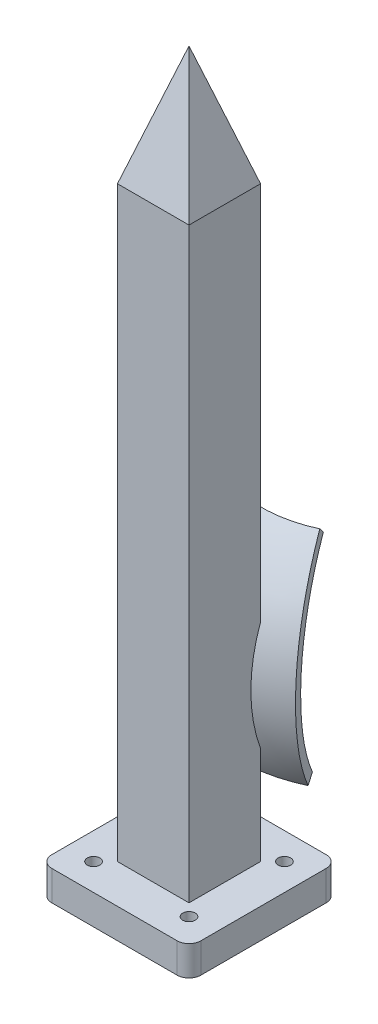
ISO-10303-21;
HEADER;
FILE_DESCRIPTION(('STEP AP214'),'2;1');
FILE_NAME('part.step','',(''),(''),'','','');
FILE_SCHEMA(('AUTOMOTIVE_DESIGN { 1 0 10303 214 1 1 1 1 }'));
ENDSEC;
DATA;
#1=APPLICATION_CONTEXT('core data for automotive mechanical design processes');
#2=APPLICATION_PROTOCOL_DEFINITION('international standard','automotive_design',2000,#1);
#3=PRODUCT_CONTEXT('',#1,'mechanical');
#4=PRODUCT('Part','Part','',(#3));
#5=PRODUCT_RELATED_PRODUCT_CATEGORY('part','',(#4));
#6=PRODUCT_DEFINITION_FORMATION('','',#4);
#7=PRODUCT_DEFINITION_CONTEXT('part definition',#1,'design');
#8=PRODUCT_DEFINITION('design','',#6,#7);
#9=PRODUCT_DEFINITION_SHAPE('','',#8);
#10=(LENGTH_UNIT() NAMED_UNIT(*) SI_UNIT(.MILLI.,.METRE.));
#11=(NAMED_UNIT(*) PLANE_ANGLE_UNIT() SI_UNIT($,.RADIAN.));
#12=(NAMED_UNIT(*) SI_UNIT($,.STERADIAN.) SOLID_ANGLE_UNIT());
#13=UNCERTAINTY_MEASURE_WITH_UNIT(LENGTH_MEASURE(1.E-05),#10,'distance_accuracy_value','');
#14=(GEOMETRIC_REPRESENTATION_CONTEXT(3) GLOBAL_UNCERTAINTY_ASSIGNED_CONTEXT((#13)) GLOBAL_UNIT_ASSIGNED_CONTEXT((#10,
#11,#12)) REPRESENTATION_CONTEXT('',''));
#15=CARTESIAN_POINT('',(0.,0.,0.));
#16=DIRECTION('',(0.,0.,1.));
#17=DIRECTION('',(1.,0.,0.));
#18=AXIS2_PLACEMENT_3D('',#15,#16,#17);
#19=CARTESIAN_POINT('',(18.5,103.425,-6.5));
#20=DIRECTION('',(-1.,0.,0.));
#21=DIRECTION('',(0.,0.,1.));
#22=AXIS2_PLACEMENT_3D('',#19,#20,#21);
#23=PLANE('',#22);
#24=CARTESIAN_POINT('',(18.5,30.6059271862154,-43.6169817591008));
#25=DIRECTION('',(-1.,0.,0.));
#26=DIRECTION('',(0.,0.,1.));
#27=AXIS2_PLACEMENT_3D('',#24,#25,#26);
#28=CIRCLE('',#27,26.7452367752012);
#29=CARTESIAN_POINT('',(18.5,39.7953187588153,-18.5));
#30=VERTEX_POINT('',#29);
#31=CARTESIAN_POINT('',(18.5,21.4165356136154,-18.5));
#32=VERTEX_POINT('',#31);
#33=EDGE_CURVE('E58',#30,#32,#28,.F.);
#34=ORIENTED_EDGE('',*,*,#33,.F.);
#35=DIRECTION('',(0.,-1.,0.));
#36=VECTOR('',#35,1.);
#37=CARTESIAN_POINT('',(18.5,103.425,-18.5));
#38=LINE('',#37,#36);
#39=CARTESIAN_POINT('',(18.5,103.425,-18.5));
#40=VERTEX_POINT('',#39);
#41=EDGE_CURVE('E304',#40,#30,#38,.T.);
#42=ORIENTED_EDGE('',*,*,#41,.F.);
#43=DIRECTION('',(0.,0.,1.));
#44=VECTOR('',#43,1.);
#45=CARTESIAN_POINT('',(18.5,103.425,-26.5));
#46=LINE('',#45,#44);
#47=CARTESIAN_POINT('',(18.5,103.425,-6.5));
#48=VERTEX_POINT('',#47);
#49=EDGE_CURVE('E253',#40,#48,#46,.T.);
#50=ORIENTED_EDGE('',*,*,#49,.T.);
#51=DIRECTION('',(0.,-1.,0.));
#52=VECTOR('',#51,1.);
#53=CARTESIAN_POINT('',(18.5,103.425,-6.5));
#54=LINE('',#53,#52);
#55=CARTESIAN_POINT('',(18.5,5.,-6.5));
#56=VERTEX_POINT('',#55);
#57=EDGE_CURVE('E306',#48,#56,#54,.T.);
#58=ORIENTED_EDGE('',*,*,#57,.T.);
#59=DIRECTION('',(0.,0.,-1.));
#60=VECTOR('',#59,1.);
#61=CARTESIAN_POINT('',(18.5,5.,-6.5));
#62=LINE('',#61,#60);
#63=CARTESIAN_POINT('',(18.5,5.,-18.5));
#64=VERTEX_POINT('',#63);
#65=EDGE_CURVE('E294',#56,#64,#62,.T.);
#66=ORIENTED_EDGE('',*,*,#65,.T.);
#67=EDGE_CURVE('E303',#32,#64,#38,.T.);
#68=ORIENTED_EDGE('',*,*,#67,.F.);
#69=EDGE_LOOP('',(#34,#42,#50,#58,#66,#68));
#70=FACE_BOUND('',#69,.T.);
#71=ADVANCED_FACE('F35',(#70),#23,.F.);
#72=CARTESIAN_POINT('',(6.5,103.425,-18.5));
#73=DIRECTION('',(0.,0.,1.));
#74=DIRECTION('',(1.,0.,0.));
#75=AXIS2_PLACEMENT_3D('',#72,#73,#74);
#76=PLANE('',#75);
#77=CARTESIAN_POINT('',(12.5,30.6059271862154,-18.5));
#78=DIRECTION('',(0.,0.,1.));
#79=DIRECTION('',(1.,0.,0.));
#80=AXIS2_PLACEMENT_3D('',#77,#78,#79);
#81=CIRCLE('',#80,10.9747399729821);
#82=CARTESIAN_POINT('',(6.5,21.4165356136154,-18.5));
#83=VERTEX_POINT('',#82);
#84=EDGE_CURVE('E51',#32,#83,#81,.F.);
#85=ORIENTED_EDGE('',*,*,#84,.F.);
#86=ORIENTED_EDGE('',*,*,#67,.T.);
#87=DIRECTION('',(-1.,0.,0.));
#88=VECTOR('',#87,1.);
#89=CARTESIAN_POINT('',(6.5,5.,-18.5));
#90=LINE('',#89,#88);
#91=CARTESIAN_POINT('',(6.5,5.,-18.5));
#92=VERTEX_POINT('',#91);
#93=EDGE_CURVE('E297',#64,#92,#90,.T.);
#94=ORIENTED_EDGE('',*,*,#93,.T.);
#95=DIRECTION('',(0.,-1.,0.));
#96=VECTOR('',#95,1.);
#97=CARTESIAN_POINT('',(6.5,103.425,-18.5));
#98=LINE('',#97,#96);
#99=EDGE_CURVE('E300',#83,#92,#98,.T.);
#100=ORIENTED_EDGE('',*,*,#99,.F.);
#101=EDGE_LOOP('',(#85,#86,#94,#100));
#102=FACE_BOUND('',#101,.T.);
#103=ADVANCED_FACE('F414',(#102),#76,.F.);
#104=CARTESIAN_POINT('',(6.5,39.7953187588153,-18.5));
#105=VERTEX_POINT('',#104);
#106=EDGE_CURVE('E201',#105,#30,#81,.F.);
#107=ORIENTED_EDGE('',*,*,#106,.F.);
#108=CARTESIAN_POINT('',(6.5,103.425,-18.5));
#109=VERTEX_POINT('',#108);
#110=EDGE_CURVE('E301',#109,#105,#98,.T.);
#111=ORIENTED_EDGE('',*,*,#110,.F.);
#112=DIRECTION('',(-1.,0.,0.));
#113=VECTOR('',#112,1.);
#114=CARTESIAN_POINT('',(26.5,103.425,-18.5));
#115=LINE('',#114,#113);
#116=EDGE_CURVE('E237',#40,#109,#115,.T.);
#117=ORIENTED_EDGE('',*,*,#116,.F.);
#118=ORIENTED_EDGE('',*,*,#41,.T.);
#119=EDGE_LOOP('',(#107,#111,#117,#118));
#120=FACE_BOUND('',#119,.T.);
#121=ADVANCED_FACE('F419',(#120),#76,.F.);
#122=CARTESIAN_POINT('',(6.5,103.425,-6.5));
#123=DIRECTION('',(1.,0.,0.));
#124=DIRECTION('',(0.,0.,-1.));
#125=AXIS2_PLACEMENT_3D('',#122,#123,#124);
#126=PLANE('',#125);
#127=CARTESIAN_POINT('',(6.5,30.6059271862154,-43.6169817591008));
#128=DIRECTION('',(1.,0.,0.));
#129=DIRECTION('',(0.,0.,-1.));
#130=AXIS2_PLACEMENT_3D('',#127,#128,#129);
#131=CIRCLE('',#130,26.7452367752012);
#132=EDGE_CURVE('E11',#83,#105,#131,.F.);
#133=ORIENTED_EDGE('',*,*,#132,.F.);
#134=ORIENTED_EDGE('',*,*,#99,.T.);
#135=DIRECTION('',(0.,0.,1.));
#136=VECTOR('',#135,1.);
#137=CARTESIAN_POINT('',(6.5,5.,-6.5));
#138=LINE('',#137,#136);
#139=CARTESIAN_POINT('',(6.5,5.,-6.5));
#140=VERTEX_POINT('',#139);
#141=EDGE_CURVE('E288',#92,#140,#138,.T.);
#142=ORIENTED_EDGE('',*,*,#141,.T.);
#143=DIRECTION('',(0.,-1.,0.));
#144=VECTOR('',#143,1.);
#145=CARTESIAN_POINT('',(6.5,103.425,-6.5));
#146=LINE('',#145,#144);
#147=CARTESIAN_POINT('',(6.5,103.425,-6.5));
#148=VERTEX_POINT('',#147);
#149=EDGE_CURVE('E308',#148,#140,#146,.T.);
#150=ORIENTED_EDGE('',*,*,#149,.F.);
#151=DIRECTION('',(0.,0.,1.));
#152=VECTOR('',#151,1.);
#153=CARTESIAN_POINT('',(6.5,103.425,-26.5));
#154=LINE('',#153,#152);
#155=EDGE_CURVE('E250',#109,#148,#154,.T.);
#156=ORIENTED_EDGE('',*,*,#155,.F.);
#157=ORIENTED_EDGE('',*,*,#110,.T.);
#158=EDGE_LOOP('',(#133,#134,#142,#150,#156,#157));
#159=FACE_BOUND('',#158,.T.);
#160=ADVANCED_FACE('F408',(#159),#126,.F.);
#161=CARTESIAN_POINT('',(6.5,103.425,-6.5));
#162=DIRECTION('',(0.,0.,-1.));
#163=DIRECTION('',(-1.,0.,0.));
#164=AXIS2_PLACEMENT_3D('',#161,#162,#163);
#165=PLANE('',#164);
#166=DIRECTION('',(-1.,0.,0.));
#167=VECTOR('',#166,1.);
#168=CARTESIAN_POINT('',(26.5,103.425,-6.5));
#169=LINE('',#168,#167);
#170=EDGE_CURVE('E244',#48,#148,#169,.T.);
#171=ORIENTED_EDGE('',*,*,#170,.T.);
#172=ORIENTED_EDGE('',*,*,#149,.T.);
#173=DIRECTION('',(1.,0.,0.));
#174=VECTOR('',#173,1.);
#175=CARTESIAN_POINT('',(6.5,5.,-6.5));
#176=LINE('',#175,#174);
#177=EDGE_CURVE('E291',#140,#56,#176,.T.);
#178=ORIENTED_EDGE('',*,*,#177,.T.);
#179=ORIENTED_EDGE('',*,*,#57,.F.);
#180=EDGE_LOOP('',(#171,#172,#178,#179));
#181=FACE_BOUND('',#180,.T.);
#182=ADVANCED_FACE('F401',(#181),#165,.F.);
#183=CARTESIAN_POINT('',(45.4380733944954,13.6314220183486,-26.5));
#184=DIRECTION('',(0.957826285221151,0.287347885566345,0.));
#185=DIRECTION('',(-0.287347885566345,0.957826285221152,0.));
#186=AXIS2_PLACEMENT_3D('',#183,#184,#185);
#187=PLANE('',#186);
#188=DIRECTION('',(0.276172385369497,-0.920574617898324,-0.276172385369497));
#189=VECTOR('',#188,1.);
#190=CARTESIAN_POINT('',(43.9936440677966,18.4461864406779,-43.9936440677966));
#191=LINE('',#190,#189);
#192=CARTESIAN_POINT('',(12.5,123.425,-12.5));
#193=VERTEX_POINT('',#192);
#194=EDGE_CURVE('E242',#193,#40,#191,.T.);
#195=ORIENTED_EDGE('',*,*,#194,.F.);
#196=DIRECTION('',(0.276172385369497,-0.920574617898324,0.276172385369497));
#197=VECTOR('',#196,1.);
#198=CARTESIAN_POINT('',(41.8580508474576,25.5648305084745,16.8580508474576));
#199=LINE('',#198,#197);
#200=EDGE_CURVE('E247',#193,#48,#199,.T.);
#201=ORIENTED_EDGE('',*,*,#200,.T.);
#202=ORIENTED_EDGE('',*,*,#49,.F.);
#203=EDGE_LOOP('',(#195,#201,#202));
#204=FACE_BOUND('',#203,.T.);
#205=ADVANCED_FACE('F424',(#204),#187,.T.);
#206=CARTESIAN_POINT('',(-22.5022935779817,6.7506880733945,-26.5));
#207=DIRECTION('',(0.957826285221151,-0.287347885566346,0.));
#208=DIRECTION('',(0.287347885566346,0.957826285221151,0.));
#209=AXIS2_PLACEMENT_3D('',#206,#207,#208);
#210=PLANE('',#209);
#211=DIRECTION('',(-0.276172385369497,-0.920574617898324,0.276172385369497));
#212=VECTOR('',#211,1.);
#213=CARTESIAN_POINT('',(-18.7648305084746,19.2088983050847,18.7648305084746));
#214=LINE('',#213,#212);
#215=EDGE_CURVE('E44',#193,#148,#214,.T.);
#216=ORIENTED_EDGE('',*,*,#215,.F.);
#217=DIRECTION('',(-0.276172385369497,-0.920574617898323,-0.276172385369497));
#218=VECTOR('',#217,1.);
#219=CARTESIAN_POINT('',(-20.9004237288136,12.0902542372881,-45.9004237288135));
#220=LINE('',#219,#218);
#221=EDGE_CURVE('E239',#193,#109,#220,.T.);
#222=ORIENTED_EDGE('',*,*,#221,.T.);
#223=ORIENTED_EDGE('',*,*,#155,.T.);
#224=EDGE_LOOP('',(#216,#222,#223));
#225=FACE_BOUND('',#224,.T.);
#226=ADVANCED_FACE('F405',(#225),#210,.F.);
#227=CARTESIAN_POINT('',(0.,5.,0.));
#228=DIRECTION('',(0.,-1.,0.));
#229=DIRECTION('',(0.,0.,-1.));
#230=AXIS2_PLACEMENT_3D('',#227,#228,#229);
#231=PLANE('',#230);
#232=CARTESIAN_POINT('',(4.5,5.,-20.5));
#233=DIRECTION('',(0.,1.,0.));
#234=DIRECTION('',(0.,0.,1.));
#235=AXIS2_PLACEMENT_3D('',#232,#233,#234);
#236=CIRCLE('',#235,1.05);
#237=CARTESIAN_POINT('',(4.5,5.,-19.45));
#238=VERTEX_POINT('',#237);
#239=EDGE_CURVE('E310',#238,#238,#236,.T.);
#240=ORIENTED_EDGE('',*,*,#239,.F.);
#241=EDGE_LOOP('',(#240));
#242=FACE_BOUND('',#241,.T.);
#243=CARTESIAN_POINT('',(20.5,5.,-20.5));
#244=DIRECTION('',(0.,1.,0.));
#245=DIRECTION('',(0.,0.,1.));
#246=AXIS2_PLACEMENT_3D('',#243,#244,#245);
#247=CIRCLE('',#246,1.05);
#248=CARTESIAN_POINT('',(20.5,5.,-19.45));
#249=VERTEX_POINT('',#248);
#250=EDGE_CURVE('E314',#249,#249,#247,.T.);
#251=ORIENTED_EDGE('',*,*,#250,.F.);
#252=EDGE_LOOP('',(#251));
#253=FACE_BOUND('',#252,.T.);
#254=CARTESIAN_POINT('',(20.5,5.,-4.5));
#255=DIRECTION('',(0.,1.,0.));
#256=DIRECTION('',(0.,0.,1.));
#257=AXIS2_PLACEMENT_3D('',#254,#255,#256);
#258=CIRCLE('',#257,1.05);
#259=CARTESIAN_POINT('',(20.5,5.,-3.45));
#260=VERTEX_POINT('',#259);
#261=EDGE_CURVE('E320',#260,#260,#258,.T.);
#262=ORIENTED_EDGE('',*,*,#261,.F.);
#263=EDGE_LOOP('',(#262));
#264=FACE_BOUND('',#263,.T.);
#265=CARTESIAN_POINT('',(4.5,5.,-4.5));
#266=DIRECTION('',(0.,1.,0.));
#267=DIRECTION('',(0.,0.,1.));
#268=AXIS2_PLACEMENT_3D('',#265,#266,#267);
#269=CIRCLE('',#268,1.05);
#270=CARTESIAN_POINT('',(4.5,5.,-3.45));
#271=VERTEX_POINT('',#270);
#272=EDGE_CURVE('E326',#271,#271,#269,.T.);
#273=ORIENTED_EDGE('',*,*,#272,.F.);
#274=EDGE_LOOP('',(#273));
#275=FACE_BOUND('',#274,.T.);
#276=DIRECTION('',(-1.,0.,0.));
#277=VECTOR('',#276,1.);
#278=CARTESIAN_POINT('',(0.,5.,-25.));
#279=LINE('',#278,#277);
#280=CARTESIAN_POINT('',(23.,5.,-25.));
#281=VERTEX_POINT('',#280);
#282=CARTESIAN_POINT('',(2.,5.,-25.));
#283=VERTEX_POINT('',#282);
#284=EDGE_CURVE('E345',#281,#283,#279,.T.);
#285=ORIENTED_EDGE('',*,*,#284,.T.);
#286=CARTESIAN_POINT('',(2.,5.,-23.));
#287=DIRECTION('',(0.,-1.,0.));
#288=DIRECTION('',(0.,0.,-1.));
#289=AXIS2_PLACEMENT_3D('',#286,#287,#288);
#290=CIRCLE('',#289,2.);
#291=CARTESIAN_POINT('',(0.,5.,-23.));
#292=VERTEX_POINT('',#291);
#293=EDGE_CURVE('E382',#283,#292,#290,.F.);
#294=ORIENTED_EDGE('',*,*,#293,.T.);
#295=DIRECTION('',(0.,0.,1.));
#296=VECTOR('',#295,1.);
#297=CARTESIAN_POINT('',(0.,5.,0.));
#298=LINE('',#297,#296);
#299=CARTESIAN_POINT('',(0.,5.,-2.));
#300=VERTEX_POINT('',#299);
#301=EDGE_CURVE('E335',#292,#300,#298,.T.);
#302=ORIENTED_EDGE('',*,*,#301,.T.);
#303=CARTESIAN_POINT('',(2.,5.,-2.));
#304=DIRECTION('',(0.,-1.,0.));
#305=DIRECTION('',(0.,0.,-1.));
#306=AXIS2_PLACEMENT_3D('',#303,#304,#305);
#307=CIRCLE('',#306,2.);
#308=CARTESIAN_POINT('',(2.,5.,0.));
#309=VERTEX_POINT('',#308);
#310=EDGE_CURVE('E380',#300,#309,#307,.F.);
#311=ORIENTED_EDGE('',*,*,#310,.T.);
#312=DIRECTION('',(1.,0.,0.));
#313=VECTOR('',#312,1.);
#314=CARTESIAN_POINT('',(0.,5.,0.));
#315=LINE('',#314,#313);
#316=CARTESIAN_POINT('',(23.,5.,0.));
#317=VERTEX_POINT('',#316);
#318=EDGE_CURVE('E338',#309,#317,#315,.T.);
#319=ORIENTED_EDGE('',*,*,#318,.T.);
#320=CARTESIAN_POINT('',(23.,5.,-2.));
#321=DIRECTION('',(0.,-1.,0.));
#322=DIRECTION('',(0.,0.,-1.));
#323=AXIS2_PLACEMENT_3D('',#320,#321,#322);
#324=CIRCLE('',#323,2.);
#325=CARTESIAN_POINT('',(25.,5.,-2.));
#326=VERTEX_POINT('',#325);
#327=EDGE_CURVE('E376',#317,#326,#324,.F.);
#328=ORIENTED_EDGE('',*,*,#327,.T.);
#329=DIRECTION('',(0.,0.,-1.));
#330=VECTOR('',#329,1.);
#331=CARTESIAN_POINT('',(25.,5.,0.));
#332=LINE('',#331,#330);
#333=CARTESIAN_POINT('',(25.,5.,-23.));
#334=VERTEX_POINT('',#333);
#335=EDGE_CURVE('E342',#326,#334,#332,.T.);
#336=ORIENTED_EDGE('',*,*,#335,.T.);
#337=CARTESIAN_POINT('',(23.,5.,-23.));
#338=DIRECTION('',(0.,-1.,0.));
#339=DIRECTION('',(0.,0.,-1.));
#340=AXIS2_PLACEMENT_3D('',#337,#338,#339);
#341=CIRCLE('',#340,2.);
#342=EDGE_CURVE('E378',#334,#281,#341,.F.);
#343=ORIENTED_EDGE('',*,*,#342,.T.);
#344=EDGE_LOOP('',(#285,#294,#302,#311,#319,#328,#336,#343));
#345=FACE_BOUND('',#344,.T.);
#346=ORIENTED_EDGE('',*,*,#141,.F.);
#347=ORIENTED_EDGE('',*,*,#93,.F.);
#348=ORIENTED_EDGE('',*,*,#65,.F.);
#349=ORIENTED_EDGE('',*,*,#177,.F.);
#350=EDGE_LOOP('',(#346,#347,#348,#349));
#351=FACE_BOUND('',#350,.T.);
#352=ADVANCED_FACE('F412',(#242,#253,#264,#275,#345,#351),#231,.F.);
#353=CARTESIAN_POINT('',(0.,5.,0.));
#354=DIRECTION('',(1.,0.,0.));
#355=DIRECTION('',(0.,0.,-1.));
#356=AXIS2_PLACEMENT_3D('',#353,#354,#355);
#357=PLANE('',#356);
#358=ORIENTED_EDGE('',*,*,#301,.F.);
#359=DIRECTION('',(0.,-1.,0.));
#360=VECTOR('',#359,1.);
#361=CARTESIAN_POINT('',(0.,5.,-23.));
#362=LINE('',#361,#360);
#363=CARTESIAN_POINT('',(0.,0.,-23.));
#364=VERTEX_POINT('',#363);
#365=EDGE_CURVE('E360',#292,#364,#362,.T.);
#366=ORIENTED_EDGE('',*,*,#365,.T.);
#367=DIRECTION('',(0.,0.,1.));
#368=VECTOR('',#367,1.);
#369=CARTESIAN_POINT('',(0.,0.,0.));
#370=LINE('',#369,#368);
#371=CARTESIAN_POINT('',(0.,0.,-2.));
#372=VERTEX_POINT('',#371);
#373=EDGE_CURVE('E332',#364,#372,#370,.T.);
#374=ORIENTED_EDGE('',*,*,#373,.T.);
#375=DIRECTION('',(0.,-1.,0.));
#376=VECTOR('',#375,1.);
#377=CARTESIAN_POINT('',(0.,5.,-2.));
#378=LINE('',#377,#376);
#379=EDGE_CURVE('E348',#372,#300,#378,.F.);
#380=ORIENTED_EDGE('',*,*,#379,.T.);
#381=EDGE_LOOP('',(#358,#366,#374,#380));
#382=FACE_BOUND('',#381,.T.);
#383=ADVANCED_FACE('F469',(#382),#357,.F.);
#384=CARTESIAN_POINT('',(0.,5.,0.));
#385=DIRECTION('',(0.,0.,-1.));
#386=DIRECTION('',(-1.,0.,0.));
#387=AXIS2_PLACEMENT_3D('',#384,#385,#386);
#388=PLANE('',#387);
#389=ORIENTED_EDGE('',*,*,#318,.F.);
#390=DIRECTION('',(0.,-1.,0.));
#391=VECTOR('',#390,1.);
#392=CARTESIAN_POINT('',(2.,5.,0.));
#393=LINE('',#392,#391);
#394=CARTESIAN_POINT('',(2.,0.,0.));
#395=VERTEX_POINT('',#394);
#396=EDGE_CURVE('E386',#309,#395,#393,.T.);
#397=ORIENTED_EDGE('',*,*,#396,.T.);
#398=DIRECTION('',(1.,0.,0.));
#399=VECTOR('',#398,1.);
#400=CARTESIAN_POINT('',(0.,0.,0.));
#401=LINE('',#400,#399);
#402=CARTESIAN_POINT('',(23.,0.,0.));
#403=VERTEX_POINT('',#402);
#404=EDGE_CURVE('E351',#395,#403,#401,.T.);
#405=ORIENTED_EDGE('',*,*,#404,.T.);
#406=DIRECTION('',(0.,-1.,0.));
#407=VECTOR('',#406,1.);
#408=CARTESIAN_POINT('',(23.,5.,0.));
#409=LINE('',#408,#407);
#410=EDGE_CURVE('E384',#403,#317,#409,.F.);
#411=ORIENTED_EDGE('',*,*,#410,.T.);
#412=EDGE_LOOP('',(#389,#397,#405,#411));
#413=FACE_BOUND('',#412,.T.);
#414=ADVANCED_FACE('F481',(#413),#388,.F.);
#415=CARTESIAN_POINT('',(25.,5.,0.));
#416=DIRECTION('',(-1.,0.,0.));
#417=DIRECTION('',(0.,0.,1.));
#418=AXIS2_PLACEMENT_3D('',#415,#416,#417);
#419=PLANE('',#418);
#420=DIRECTION('',(0.,0.,-1.));
#421=VECTOR('',#420,1.);
#422=CARTESIAN_POINT('',(25.,0.,0.));
#423=LINE('',#422,#421);
#424=CARTESIAN_POINT('',(25.,0.,-2.));
#425=VERTEX_POINT('',#424);
#426=CARTESIAN_POINT('',(25.,0.,-23.));
#427=VERTEX_POINT('',#426);
#428=EDGE_CURVE('E354',#425,#427,#423,.T.);
#429=ORIENTED_EDGE('',*,*,#428,.T.);
#430=DIRECTION('',(0.,-1.,0.));
#431=VECTOR('',#430,1.);
#432=CARTESIAN_POINT('',(25.,5.,-23.));
#433=LINE('',#432,#431);
#434=EDGE_CURVE('E392',#427,#334,#433,.F.);
#435=ORIENTED_EDGE('',*,*,#434,.T.);
#436=ORIENTED_EDGE('',*,*,#335,.F.);
#437=DIRECTION('',(0.,-1.,0.));
#438=VECTOR('',#437,1.);
#439=CARTESIAN_POINT('',(25.,5.,-2.));
#440=LINE('',#439,#438);
#441=EDGE_CURVE('E389',#326,#425,#440,.T.);
#442=ORIENTED_EDGE('',*,*,#441,.T.);
#443=EDGE_LOOP('',(#429,#435,#436,#442));
#444=FACE_BOUND('',#443,.T.);
#445=ADVANCED_FACE('F477',(#444),#419,.F.);
#446=CARTESIAN_POINT('',(0.,5.,-25.));
#447=DIRECTION('',(0.,0.,1.));
#448=DIRECTION('',(1.,0.,0.));
#449=AXIS2_PLACEMENT_3D('',#446,#447,#448);
#450=PLANE('',#449);
#451=DIRECTION('',(-1.,0.,0.));
#452=VECTOR('',#451,1.);
#453=CARTESIAN_POINT('',(0.,0.,-25.));
#454=LINE('',#453,#452);
#455=CARTESIAN_POINT('',(23.,0.,-25.));
#456=VERTEX_POINT('',#455);
#457=CARTESIAN_POINT('',(2.,0.,-25.));
#458=VERTEX_POINT('',#457);
#459=EDGE_CURVE('E339',#456,#458,#454,.T.);
#460=ORIENTED_EDGE('',*,*,#459,.T.);
#461=DIRECTION('',(0.,-1.,0.));
#462=VECTOR('',#461,1.);
#463=CARTESIAN_POINT('',(2.,5.,-25.));
#464=LINE('',#463,#462);
#465=EDGE_CURVE('E374',#458,#283,#464,.F.);
#466=ORIENTED_EDGE('',*,*,#465,.T.);
#467=ORIENTED_EDGE('',*,*,#284,.F.);
#468=DIRECTION('',(0.,-1.,0.));
#469=VECTOR('',#468,1.);
#470=CARTESIAN_POINT('',(23.,5.,-25.));
#471=LINE('',#470,#469);
#472=EDGE_CURVE('E371',#281,#456,#471,.T.);
#473=ORIENTED_EDGE('',*,*,#472,.T.);
#474=EDGE_LOOP('',(#460,#466,#467,#473));
#475=FACE_BOUND('',#474,.T.);
#476=ADVANCED_FACE('F473',(#475),#450,.F.);
#477=CARTESIAN_POINT('',(0.,0.,0.));
#478=DIRECTION('',(0.,-1.,0.));
#479=DIRECTION('',(0.,0.,-1.));
#480=AXIS2_PLACEMENT_3D('',#477,#478,#479);
#481=PLANE('',#480);
#482=DIRECTION('',(0.,0.,1.));
#483=VECTOR('',#482,1.);
#484=CARTESIAN_POINT('',(15.5,0.,-9.50000000000001));
#485=LINE('',#484,#483);
#486=CARTESIAN_POINT('',(15.5,0.,-15.5));
#487=VERTEX_POINT('',#486);
#488=CARTESIAN_POINT('',(15.5,0.,-9.50000000000001));
#489=VERTEX_POINT('',#488);
#490=EDGE_CURVE('E256',#487,#489,#485,.T.);
#491=ORIENTED_EDGE('',*,*,#490,.F.);
#492=DIRECTION('',(1.,0.,0.));
#493=VECTOR('',#492,1.);
#494=CARTESIAN_POINT('',(9.5,0.,-15.5));
#495=LINE('',#494,#493);
#496=CARTESIAN_POINT('',(9.5,0.,-15.5));
#497=VERTEX_POINT('',#496);
#498=EDGE_CURVE('E265',#497,#487,#495,.T.);
#499=ORIENTED_EDGE('',*,*,#498,.F.);
#500=DIRECTION('',(0.,0.,-1.));
#501=VECTOR('',#500,1.);
#502=CARTESIAN_POINT('',(9.5,0.,-9.50000000000001));
#503=LINE('',#502,#501);
#504=CARTESIAN_POINT('',(9.5,0.,-9.50000000000001));
#505=VERTEX_POINT('',#504);
#506=EDGE_CURVE('E262',#505,#497,#503,.T.);
#507=ORIENTED_EDGE('',*,*,#506,.F.);
#508=DIRECTION('',(-1.,0.,0.));
#509=VECTOR('',#508,1.);
#510=CARTESIAN_POINT('',(9.5,0.,-9.50000000000001));
#511=LINE('',#510,#509);
#512=EDGE_CURVE('E259',#489,#505,#511,.T.);
#513=ORIENTED_EDGE('',*,*,#512,.F.);
#514=EDGE_LOOP('',(#491,#499,#507,#513));
#515=FACE_BOUND('',#514,.T.);
#516=CARTESIAN_POINT('',(4.5,0.,-20.5));
#517=DIRECTION('',(0.,1.,0.));
#518=DIRECTION('',(0.,0.,1.));
#519=AXIS2_PLACEMENT_3D('',#516,#517,#518);
#520=CIRCLE('',#519,1.05);
#521=CARTESIAN_POINT('',(4.5,0.,-19.45));
#522=VERTEX_POINT('',#521);
#523=EDGE_CURVE('E311',#522,#522,#520,.T.);
#524=ORIENTED_EDGE('',*,*,#523,.T.);
#525=EDGE_LOOP('',(#524));
#526=FACE_BOUND('',#525,.T.);
#527=CARTESIAN_POINT('',(20.5,0.,-20.5));
#528=DIRECTION('',(0.,1.,0.));
#529=DIRECTION('',(0.,0.,1.));
#530=AXIS2_PLACEMENT_3D('',#527,#528,#529);
#531=CIRCLE('',#530,1.05);
#532=CARTESIAN_POINT('',(20.5,0.,-19.45));
#533=VERTEX_POINT('',#532);
#534=EDGE_CURVE('E317',#533,#533,#531,.T.);
#535=ORIENTED_EDGE('',*,*,#534,.T.);
#536=EDGE_LOOP('',(#535));
#537=FACE_BOUND('',#536,.T.);
#538=CARTESIAN_POINT('',(20.5,0.,-4.5));
#539=DIRECTION('',(0.,1.,0.));
#540=DIRECTION('',(0.,0.,1.));
#541=AXIS2_PLACEMENT_3D('',#538,#539,#540);
#542=CIRCLE('',#541,1.05);
#543=CARTESIAN_POINT('',(20.5,0.,-3.45));
#544=VERTEX_POINT('',#543);
#545=EDGE_CURVE('E323',#544,#544,#542,.T.);
#546=ORIENTED_EDGE('',*,*,#545,.T.);
#547=EDGE_LOOP('',(#546));
#548=FACE_BOUND('',#547,.T.);
#549=CARTESIAN_POINT('',(4.5,0.,-4.5));
#550=DIRECTION('',(0.,1.,0.));
#551=DIRECTION('',(0.,0.,1.));
#552=AXIS2_PLACEMENT_3D('',#549,#550,#551);
#553=CIRCLE('',#552,1.05);
#554=CARTESIAN_POINT('',(4.5,0.,-3.45));
#555=VERTEX_POINT('',#554);
#556=EDGE_CURVE('E329',#555,#555,#553,.T.);
#557=ORIENTED_EDGE('',*,*,#556,.T.);
#558=EDGE_LOOP('',(#557));
#559=FACE_BOUND('',#558,.T.);
#560=ORIENTED_EDGE('',*,*,#373,.F.);
#561=CARTESIAN_POINT('',(2.,0.,-23.));
#562=DIRECTION('',(0.,-1.,0.));
#563=DIRECTION('',(0.,0.,-1.));
#564=AXIS2_PLACEMENT_3D('',#561,#562,#563);
#565=CIRCLE('',#564,2.);
#566=EDGE_CURVE('E369',#364,#458,#565,.T.);
#567=ORIENTED_EDGE('',*,*,#566,.T.);
#568=ORIENTED_EDGE('',*,*,#459,.F.);
#569=CARTESIAN_POINT('',(23.,0.,-23.));
#570=DIRECTION('',(0.,-1.,0.));
#571=DIRECTION('',(0.,0.,-1.));
#572=AXIS2_PLACEMENT_3D('',#569,#570,#571);
#573=CIRCLE('',#572,2.);
#574=EDGE_CURVE('E365',#456,#427,#573,.T.);
#575=ORIENTED_EDGE('',*,*,#574,.T.);
#576=ORIENTED_EDGE('',*,*,#428,.F.);
#577=CARTESIAN_POINT('',(23.,0.,-2.));
#578=DIRECTION('',(0.,-1.,0.));
#579=DIRECTION('',(0.,0.,-1.));
#580=AXIS2_PLACEMENT_3D('',#577,#578,#579);
#581=CIRCLE('',#580,2.);
#582=EDGE_CURVE('E363',#425,#403,#581,.T.);
#583=ORIENTED_EDGE('',*,*,#582,.T.);
#584=ORIENTED_EDGE('',*,*,#404,.F.);
#585=CARTESIAN_POINT('',(2.,0.,-2.));
#586=DIRECTION('',(0.,-1.,0.));
#587=DIRECTION('',(0.,0.,-1.));
#588=AXIS2_PLACEMENT_3D('',#585,#586,#587);
#589=CIRCLE('',#588,2.);
#590=EDGE_CURVE('E367',#395,#372,#589,.T.);
#591=ORIENTED_EDGE('',*,*,#590,.T.);
#592=EDGE_LOOP('',(#560,#567,#568,#575,#576,#583,#584,#591));
#593=FACE_BOUND('',#592,.T.);
#594=ADVANCED_FACE('F465',(#515,#526,#537,#548,#559,#593),#481,.T.);
#595=CARTESIAN_POINT('',(4.5,0.,-4.5));
#596=DIRECTION('',(0.,1.,0.));
#597=DIRECTION('',(0.,0.,1.));
#598=AXIS2_PLACEMENT_3D('',#595,#596,#597);
#599=CYLINDRICAL_SURFACE('',#598,1.05);
#600=ORIENTED_EDGE('',*,*,#556,.F.);
#601=EDGE_LOOP('',(#600));
#602=FACE_BOUND('',#601,.T.);
#603=ORIENTED_EDGE('',*,*,#272,.T.);
#604=EDGE_LOOP('',(#603));
#605=FACE_BOUND('',#604,.T.);
#606=ADVANCED_FACE('F461',(#602,#605),#599,.F.);
#607=CARTESIAN_POINT('',(20.5,0.,-4.5));
#608=DIRECTION('',(0.,1.,0.));
#609=DIRECTION('',(0.,0.,1.));
#610=AXIS2_PLACEMENT_3D('',#607,#608,#609);
#611=CYLINDRICAL_SURFACE('',#610,1.05);
#612=ORIENTED_EDGE('',*,*,#545,.F.);
#613=EDGE_LOOP('',(#612));
#614=FACE_BOUND('',#613,.T.);
#615=ORIENTED_EDGE('',*,*,#261,.T.);
#616=EDGE_LOOP('',(#615));
#617=FACE_BOUND('',#616,.T.);
#618=ADVANCED_FACE('F457',(#614,#617),#611,.F.);
#619=CARTESIAN_POINT('',(20.5,0.,-20.5));
#620=DIRECTION('',(0.,1.,0.));
#621=DIRECTION('',(0.,0.,1.));
#622=AXIS2_PLACEMENT_3D('',#619,#620,#621);
#623=CYLINDRICAL_SURFACE('',#622,1.05);
#624=ORIENTED_EDGE('',*,*,#534,.F.);
#625=EDGE_LOOP('',(#624));
#626=FACE_BOUND('',#625,.T.);
#627=ORIENTED_EDGE('',*,*,#250,.T.);
#628=EDGE_LOOP('',(#627));
#629=FACE_BOUND('',#628,.T.);
#630=ADVANCED_FACE('F453',(#626,#629),#623,.F.);
#631=CARTESIAN_POINT('',(4.5,0.,-20.5));
#632=DIRECTION('',(0.,1.,0.));
#633=DIRECTION('',(0.,0.,1.));
#634=AXIS2_PLACEMENT_3D('',#631,#632,#633);
#635=CYLINDRICAL_SURFACE('',#634,1.05);
#636=ORIENTED_EDGE('',*,*,#523,.F.);
#637=EDGE_LOOP('',(#636));
#638=FACE_BOUND('',#637,.T.);
#639=ORIENTED_EDGE('',*,*,#239,.T.);
#640=EDGE_LOOP('',(#639));
#641=FACE_BOUND('',#640,.T.);
#642=ADVANCED_FACE('F449',(#638,#641),#635,.F.);
#643=CARTESIAN_POINT('',(2.,5.,-23.));
#644=DIRECTION('',(0.,-1.,0.));
#645=DIRECTION('',(0.,0.,-1.));
#646=AXIS2_PLACEMENT_3D('',#643,#644,#645);
#647=CYLINDRICAL_SURFACE('',#646,2.);
#648=ORIENTED_EDGE('',*,*,#293,.F.);
#649=ORIENTED_EDGE('',*,*,#465,.F.);
#650=ORIENTED_EDGE('',*,*,#566,.F.);
#651=ORIENTED_EDGE('',*,*,#365,.F.);
#652=EDGE_LOOP('',(#648,#649,#650,#651));
#653=FACE_BOUND('',#652,.T.);
#654=ADVANCED_FACE('F452',(#653),#647,.T.);
#655=CARTESIAN_POINT('',(2.,5.,-2.));
#656=DIRECTION('',(0.,-1.,0.));
#657=DIRECTION('',(0.,0.,-1.));
#658=AXIS2_PLACEMENT_3D('',#655,#656,#657);
#659=CYLINDRICAL_SURFACE('',#658,2.);
#660=ORIENTED_EDGE('',*,*,#310,.F.);
#661=ORIENTED_EDGE('',*,*,#379,.F.);
#662=ORIENTED_EDGE('',*,*,#590,.F.);
#663=ORIENTED_EDGE('',*,*,#396,.F.);
#664=EDGE_LOOP('',(#660,#661,#662,#663));
#665=FACE_BOUND('',#664,.T.);
#666=ADVANCED_FACE('F491',(#665),#659,.T.);
#667=CARTESIAN_POINT('',(23.,5.,-23.));
#668=DIRECTION('',(0.,-1.,0.));
#669=DIRECTION('',(0.,0.,-1.));
#670=AXIS2_PLACEMENT_3D('',#667,#668,#669);
#671=CYLINDRICAL_SURFACE('',#670,2.);
#672=ORIENTED_EDGE('',*,*,#342,.F.);
#673=ORIENTED_EDGE('',*,*,#434,.F.);
#674=ORIENTED_EDGE('',*,*,#574,.F.);
#675=ORIENTED_EDGE('',*,*,#472,.F.);
#676=EDGE_LOOP('',(#672,#673,#674,#675));
#677=FACE_BOUND('',#676,.T.);
#678=ADVANCED_FACE('F494',(#677),#671,.T.);
#679=CARTESIAN_POINT('',(23.,5.,-2.));
#680=DIRECTION('',(0.,-1.,0.));
#681=DIRECTION('',(0.,0.,-1.));
#682=AXIS2_PLACEMENT_3D('',#679,#680,#681);
#683=CYLINDRICAL_SURFACE('',#682,2.);
#684=ORIENTED_EDGE('',*,*,#327,.F.);
#685=ORIENTED_EDGE('',*,*,#410,.F.);
#686=ORIENTED_EDGE('',*,*,#582,.F.);
#687=ORIENTED_EDGE('',*,*,#441,.F.);
#688=EDGE_LOOP('',(#684,#685,#686,#687));
#689=FACE_BOUND('',#688,.T.);
#690=ADVANCED_FACE('F37',(#689),#683,.T.);
#691=CARTESIAN_POINT('',(15.5,103.425,-15.5));
#692=DIRECTION('',(-1.,0.,0.));
#693=DIRECTION('',(0.,0.,1.));
#694=AXIS2_PLACEMENT_3D('',#691,#692,#693);
#695=PLANE('',#694);
#696=ORIENTED_EDGE('',*,*,#490,.T.);
#697=DIRECTION('',(0.,-1.,0.));
#698=VECTOR('',#697,1.);
#699=CARTESIAN_POINT('',(15.5,103.425,-9.5));
#700=LINE('',#699,#698);
#701=CARTESIAN_POINT('',(15.5,103.425,-9.5));
#702=VERTEX_POINT('',#701);
#703=EDGE_CURVE('E280',#702,#489,#700,.T.);
#704=ORIENTED_EDGE('',*,*,#703,.F.);
#705=DIRECTION('',(0.,0.,-1.));
#706=VECTOR('',#705,1.);
#707=CARTESIAN_POINT('',(15.5,103.425,-15.5));
#708=LINE('',#707,#706);
#709=CARTESIAN_POINT('',(15.5,103.425,-15.5));
#710=VERTEX_POINT('',#709);
#711=EDGE_CURVE('E268',#702,#710,#708,.T.);
#712=ORIENTED_EDGE('',*,*,#711,.T.);
#713=DIRECTION('',(0.,-1.,0.));
#714=VECTOR('',#713,1.);
#715=CARTESIAN_POINT('',(15.5,103.425,-15.5));
#716=LINE('',#715,#714);
#717=EDGE_CURVE('E286',#710,#487,#716,.T.);
#718=ORIENTED_EDGE('',*,*,#717,.T.);
#719=EDGE_LOOP('',(#696,#704,#712,#718));
#720=FACE_BOUND('',#719,.T.);
#721=ADVANCED_FACE('F501',(#720),#695,.T.);
#722=CARTESIAN_POINT('',(9.5,103.425,-15.5));
#723=DIRECTION('',(0.,0.,1.));
#724=DIRECTION('',(1.,0.,0.));
#725=AXIS2_PLACEMENT_3D('',#722,#723,#724);
#726=PLANE('',#725);
#727=ORIENTED_EDGE('',*,*,#498,.T.);
#728=ORIENTED_EDGE('',*,*,#717,.F.);
#729=DIRECTION('',(-1.,0.,0.));
#730=VECTOR('',#729,1.);
#731=CARTESIAN_POINT('',(9.5,103.425,-15.5));
#732=LINE('',#731,#730);
#733=CARTESIAN_POINT('',(9.5,103.425,-15.5));
#734=VERTEX_POINT('',#733);
#735=EDGE_CURVE('E271',#710,#734,#732,.T.);
#736=ORIENTED_EDGE('',*,*,#735,.T.);
#737=DIRECTION('',(0.,-1.,0.));
#738=VECTOR('',#737,1.);
#739=CARTESIAN_POINT('',(9.5,103.425,-15.5));
#740=LINE('',#739,#738);
#741=EDGE_CURVE('E284',#734,#497,#740,.T.);
#742=ORIENTED_EDGE('',*,*,#741,.T.);
#743=EDGE_LOOP('',(#727,#728,#736,#742));
#744=FACE_BOUND('',#743,.T.);
#745=ADVANCED_FACE('F528',(#744),#726,.T.);
#746=CARTESIAN_POINT('',(9.5,103.425,-15.5));
#747=DIRECTION('',(1.,0.,0.));
#748=DIRECTION('',(0.,0.,-1.));
#749=AXIS2_PLACEMENT_3D('',#746,#747,#748);
#750=PLANE('',#749);
#751=ORIENTED_EDGE('',*,*,#506,.T.);
#752=ORIENTED_EDGE('',*,*,#741,.F.);
#753=DIRECTION('',(0.,0.,1.));
#754=VECTOR('',#753,1.);
#755=CARTESIAN_POINT('',(9.5,103.425,-15.5));
#756=LINE('',#755,#754);
#757=CARTESIAN_POINT('',(9.5,103.425,-9.5));
#758=VERTEX_POINT('',#757);
#759=EDGE_CURVE('E274',#734,#758,#756,.T.);
#760=ORIENTED_EDGE('',*,*,#759,.T.);
#761=DIRECTION('',(0.,-1.,0.));
#762=VECTOR('',#761,1.);
#763=CARTESIAN_POINT('',(9.5,103.425,-9.5));
#764=LINE('',#763,#762);
#765=EDGE_CURVE('E282',#758,#505,#764,.T.);
#766=ORIENTED_EDGE('',*,*,#765,.T.);
#767=EDGE_LOOP('',(#751,#752,#760,#766));
#768=FACE_BOUND('',#767,.T.);
#769=ADVANCED_FACE('F533',(#768),#750,.T.);
#770=CARTESIAN_POINT('',(9.5,103.425,-9.5));
#771=DIRECTION('',(0.,0.,-1.));
#772=DIRECTION('',(-1.,0.,0.));
#773=AXIS2_PLACEMENT_3D('',#770,#771,#772);
#774=PLANE('',#773);
#775=ORIENTED_EDGE('',*,*,#512,.T.);
#776=ORIENTED_EDGE('',*,*,#765,.F.);
#777=DIRECTION('',(1.,0.,0.));
#778=VECTOR('',#777,1.);
#779=CARTESIAN_POINT('',(9.5,103.425,-9.5));
#780=LINE('',#779,#778);
#781=EDGE_CURVE('E277',#758,#702,#780,.T.);
#782=ORIENTED_EDGE('',*,*,#781,.T.);
#783=ORIENTED_EDGE('',*,*,#703,.T.);
#784=EDGE_LOOP('',(#775,#776,#782,#783));
#785=FACE_BOUND('',#784,.T.);
#786=ADVANCED_FACE('F539',(#785),#774,.T.);
#787=CARTESIAN_POINT('',(0.,103.425,0.));
#788=DIRECTION('',(0.,-1.,0.));
#789=DIRECTION('',(0.,0.,-1.));
#790=AXIS2_PLACEMENT_3D('',#787,#788,#789);
#791=PLANE('',#790);
#792=ORIENTED_EDGE('',*,*,#735,.F.);
#793=ORIENTED_EDGE('',*,*,#711,.F.);
#794=ORIENTED_EDGE('',*,*,#781,.F.);
#795=ORIENTED_EDGE('',*,*,#759,.F.);
#796=EDGE_LOOP('',(#792,#793,#794,#795));
#797=FACE_BOUND('',#796,.T.);
#798=ADVANCED_FACE('F434',(#797),#791,.T.);
#799=CARTESIAN_POINT('',(26.5,6.75068807339448,22.5022935779816));
#800=DIRECTION('',(0.,0.287347885566345,0.957826285221151));
#801=DIRECTION('',(0.,-0.957826285221152,0.287347885566345));
#802=AXIS2_PLACEMENT_3D('',#799,#800,#801);
#803=PLANE('',#802);
#804=ORIENTED_EDGE('',*,*,#215,.T.);
#805=ORIENTED_EDGE('',*,*,#170,.F.);
#806=ORIENTED_EDGE('',*,*,#200,.F.);
#807=EDGE_LOOP('',(#804,#805,#806));
#808=FACE_BOUND('',#807,.T.);
#809=ADVANCED_FACE('F397',(#808),#803,.T.);
#810=CARTESIAN_POINT('',(26.5,13.6314220183486,-45.4380733944954));
#811=DIRECTION('',(0.,-0.287347885566345,0.957826285221152));
#812=DIRECTION('',(0.,-0.957826285221152,-0.287347885566345));
#813=AXIS2_PLACEMENT_3D('',#810,#811,#812);
#814=PLANE('',#813);
#815=ORIENTED_EDGE('',*,*,#194,.T.);
#816=ORIENTED_EDGE('',*,*,#116,.T.);
#817=ORIENTED_EDGE('',*,*,#221,.F.);
#818=EDGE_LOOP('',(#815,#816,#817));
#819=FACE_BOUND('',#818,.T.);
#820=ADVANCED_FACE('F426',(#819),#814,.F.);
#821=CARTESIAN_POINT('',(12.5,30.6059271862154,-43.6169817591008));
#822=DIRECTION('',(0.,1.,0.));
#823=DIRECTION('',(-0.4226182617407,0.,0.90630778703665));
#824=AXIS2_PLACEMENT_3D('',#821,#822,#823);
#825=SPHERICAL_SURFACE('',#824,25.6199469617793);
#826=CARTESIAN_POINT('',(12.5,49.0814718555662,-43.6169817591008));
#827=DIRECTION('',(0.,1.,0.));
#828=DIRECTION('',(0.,0.,1.));
#829=AXIS2_PLACEMENT_3D('',#826,#827,#828);
#830=CIRCLE('',#829,17.7492515756357);
#831=CARTESIAN_POINT('',(4.99884215190647,49.0814718555662,-27.5306968420297));
#832=VERTEX_POINT('',#831);
#833=CARTESIAN_POINT('',(20.0011578480935,49.0814718555662,-27.5306968420297));
#834=VERTEX_POINT('',#833);
#835=EDGE_CURVE('E202',#832,#834,#830,.T.);
#836=ORIENTED_EDGE('',*,*,#835,.T.);
#837=CARTESIAN_POINT('',(12.5,30.6059271862154,-43.6169817591008));
#838=DIRECTION('',(0.90630778703665,0.,-0.4226182617407));
#839=DIRECTION('',(-0.4226182617407,0.,-0.90630778703665));
#840=AXIS2_PLACEMENT_3D('',#837,#838,#839);
#841=CIRCLE('',#840,25.6199469617793);
#842=CARTESIAN_POINT('',(21.6083862279321,16.7538154660889,-24.0839844586265));
#843=VERTEX_POINT('',#842);
#844=EDGE_CURVE('E208',#843,#834,#841,.F.);
#845=ORIENTED_EDGE('',*,*,#844,.F.);
#846=CARTESIAN_POINT('',(12.5,16.7538154660889,-43.6169817591008));
#847=DIRECTION('',(0.,1.,0.));
#848=DIRECTION('',(0.,0.,1.));
#849=AXIS2_PLACEMENT_3D('',#846,#847,#848);
#850=CIRCLE('',#849,21.5522779124973);
#851=CARTESIAN_POINT('',(3.3916137720679,16.7538154660889,-24.0839844586265));
#852=VERTEX_POINT('',#851);
#853=EDGE_CURVE('E190',#852,#843,#850,.T.);
#854=ORIENTED_EDGE('',*,*,#853,.F.);
#855=CARTESIAN_POINT('',(12.5,30.6059271862154,-43.6169817591008));
#856=DIRECTION('',(0.90630778703665,0.,0.4226182617407));
#857=DIRECTION('',(0.4226182617407,0.,-0.90630778703665));
#858=AXIS2_PLACEMENT_3D('',#855,#856,#857);
#859=CIRCLE('',#858,25.6199469617793);
#860=EDGE_CURVE('E221',#852,#832,#859,.F.);
#861=ORIENTED_EDGE('',*,*,#860,.T.);
#862=EDGE_LOOP('',(#836,#845,#854,#861));
#863=FACE_BOUND('',#862,.T.);
#864=CARTESIAN_POINT('',(12.5,30.6059271862154,-18.5));
#865=DIRECTION('',(0.,0.,1.));
#866=DIRECTION('',(1.,0.,0.));
#867=AXIS2_PLACEMENT_3D('',#864,#865,#866);
#868=CIRCLE('',#867,5.05162445529979);
#869=CARTESIAN_POINT('',(17.5516244552998,30.6059271862154,-18.5));
#870=VERTEX_POINT('',#869);
#871=EDGE_CURVE('E39',#870,#870,#868,.F.);
#872=ORIENTED_EDGE('',*,*,#871,.F.);
#873=EDGE_LOOP('',(#872));
#874=FACE_BOUND('',#873,.T.);
#875=ADVANCED_FACE('F213',(#863,#874),#825,.F.);
#876=CARTESIAN_POINT('',(12.5,30.6059271862154,-43.6169817591008));
#877=DIRECTION('',(0.,1.,0.));
#878=DIRECTION('',(-0.4226182617407,0.,0.90630778703665));
#879=AXIS2_PLACEMENT_3D('',#876,#877,#878);
#880=SPHERICAL_SURFACE('',#879,27.4099925239241);
#881=CARTESIAN_POINT('',(12.5,30.6059271862154,-43.6169817591008));
#882=DIRECTION('',(0.90630778703665,0.,0.4226182617407));
#883=DIRECTION('',(0.4226182617407,0.,-0.90630778703665));
#884=AXIS2_PLACEMENT_3D('',#881,#882,#883);
#885=CIRCLE('',#884,27.4099925239241);
#886=CARTESIAN_POINT('',(2.75521798366389,15.78597930515,-22.719229286211));
#887=VERTEX_POINT('',#886);
#888=CARTESIAN_POINT('',(4.47474214744672,50.3723436435882,-26.4067607554266));
#889=VERTEX_POINT('',#888);
#890=EDGE_CURVE('E226',#887,#889,#885,.F.);
#891=ORIENTED_EDGE('',*,*,#890,.F.);
#892=CARTESIAN_POINT('',(12.5,15.78597930515,-43.6169817591008));
#893=DIRECTION('',(0.,1.,0.));
#894=DIRECTION('',(0.,0.,1.));
#895=AXIS2_PLACEMENT_3D('',#892,#893,#894);
#896=CIRCLE('',#895,23.0581186345305);
#897=CARTESIAN_POINT('',(22.2447820163361,15.78597930515,-22.719229286211));
#898=VERTEX_POINT('',#897);
#899=EDGE_CURVE('E229',#887,#898,#896,.T.);
#900=ORIENTED_EDGE('',*,*,#899,.T.);
#901=CARTESIAN_POINT('',(12.5,30.6059271862154,-43.6169817591008));
#902=DIRECTION('',(0.90630778703665,0.,-0.4226182617407));
#903=DIRECTION('',(-0.4226182617407,0.,-0.90630778703665));
#904=AXIS2_PLACEMENT_3D('',#901,#902,#903);
#905=CIRCLE('',#904,27.4099925239241);
#906=CARTESIAN_POINT('',(20.5252578525533,50.3723436435882,-26.4067607554266));
#907=VERTEX_POINT('',#906);
#908=EDGE_CURVE('E211',#898,#907,#905,.F.);
#909=ORIENTED_EDGE('',*,*,#908,.T.);
#910=CARTESIAN_POINT('',(12.5,50.3723436435882,-43.6169817591008));
#911=DIRECTION('',(0.,1.,0.));
#912=DIRECTION('',(0.,0.,1.));
#913=AXIS2_PLACEMENT_3D('',#910,#911,#912);
#914=CIRCLE('',#913,18.9893778359186);
#915=EDGE_CURVE('E231',#889,#907,#914,.T.);
#916=ORIENTED_EDGE('',*,*,#915,.F.);
#917=EDGE_LOOP('',(#891,#900,#909,#916));
#918=FACE_BOUND('',#917,.T.);
#919=ORIENTED_EDGE('',*,*,#106,.T.);
#920=ORIENTED_EDGE('',*,*,#33,.T.);
#921=ORIENTED_EDGE('',*,*,#84,.T.);
#922=ORIENTED_EDGE('',*,*,#132,.T.);
#923=EDGE_LOOP('',(#919,#920,#921,#922));
#924=FACE_BOUND('',#923,.T.);
#925=ADVANCED_FACE('F416',(#918,#924),#880,.T.);
#926=CARTESIAN_POINT('',(12.5,15.78597930515,-43.6169817591008));
#927=DIRECTION('',(0.,-1.,0.));
#928=DIRECTION('',(0.,0.,-1.));
#929=AXIS2_PLACEMENT_3D('',#926,#927,#928);
#930=CONICAL_SURFACE('',#929,23.0581186345305,0.99955485316327);
#931=ORIENTED_EDGE('',*,*,#853,.T.);
#932=DIRECTION('',(-0.355519324123516,0.540676830470864,-0.762413650957759));
#933=VECTOR('',#932,1.);
#934=CARTESIAN_POINT('',(31.4277941285924,1.82037590153494,-3.02619626035419));
#935=LINE('',#934,#933);
#936=EDGE_CURVE('E193',#898,#843,#935,.T.);
#937=ORIENTED_EDGE('',*,*,#936,.F.);
#938=ORIENTED_EDGE('',*,*,#899,.F.);
#939=DIRECTION('',(0.355519324123516,0.540676830470864,-0.762413650957759));
#940=VECTOR('',#939,1.);
#941=CARTESIAN_POINT('',(-6.42779412859245,1.82037590153494,-3.0261962603542));
#942=LINE('',#941,#940);
#943=EDGE_CURVE('E196',#887,#852,#942,.T.);
#944=ORIENTED_EDGE('',*,*,#943,.T.);
#945=EDGE_LOOP('',(#931,#937,#938,#944));
#946=FACE_BOUND('',#945,.T.);
#947=ADVANCED_FACE('F192',(#946),#930,.F.);
#948=CARTESIAN_POINT('',(12.5,49.0814718555662,-43.6169817591008));
#949=DIRECTION('',(0.,1.,0.));
#950=DIRECTION('',(0.,0.,1.));
#951=AXIS2_PLACEMENT_3D('',#948,#949,#950);
#952=CONICAL_SURFACE('',#951,17.7492515756357,0.765351237745713);
#953=ORIENTED_EDGE('',*,*,#915,.T.);
#954=DIRECTION('',(0.292785846094217,0.721139067809677,0.627881273176294));
#955=VECTOR('',#954,1.);
#956=CARTESIAN_POINT('',(14.885119434144,36.4805376849751,-38.5020766263371));
#957=LINE('',#956,#955);
#958=EDGE_CURVE('E215',#834,#907,#957,.T.);
#959=ORIENTED_EDGE('',*,*,#958,.F.);
#960=ORIENTED_EDGE('',*,*,#835,.F.);
#961=DIRECTION('',(-0.292785846094217,0.721139067809677,0.627881273176294));
#962=VECTOR('',#961,1.);
#963=CARTESIAN_POINT('',(10.114880565856,36.4805376849751,-38.5020766263371));
#964=LINE('',#963,#962);
#965=EDGE_CURVE('E223',#832,#889,#964,.T.);
#966=ORIENTED_EDGE('',*,*,#965,.T.);
#967=EDGE_LOOP('',(#953,#959,#960,#966));
#968=FACE_BOUND('',#967,.T.);
#969=ADVANCED_FACE('F734',(#968),#952,.F.);
#970=CARTESIAN_POINT('',(-5.933333013407,0.,-4.08657154379224));
#971=DIRECTION('',(0.90630778703665,0.,0.4226182617407));
#972=DIRECTION('',(0.4226182617407,0.,-0.90630778703665));
#973=AXIS2_PLACEMENT_3D('',#970,#971,#972);
#974=PLANE('',#973);
#975=ORIENTED_EDGE('',*,*,#943,.F.);
#976=ORIENTED_EDGE('',*,*,#890,.T.);
#977=ORIENTED_EDGE('',*,*,#965,.F.);
#978=ORIENTED_EDGE('',*,*,#860,.F.);
#979=EDGE_LOOP('',(#975,#976,#977,#978));
#980=FACE_BOUND('',#979,.T.);
#981=ADVANCED_FACE('F742',(#980),#974,.F.);
#982=CARTESIAN_POINT('',(30.933333013407,0.,-4.08657154379224));
#983=DIRECTION('',(0.90630778703665,0.,-0.4226182617407));
#984=DIRECTION('',(-0.4226182617407,0.,-0.90630778703665));
#985=AXIS2_PLACEMENT_3D('',#982,#983,#984);
#986=PLANE('',#985);
#987=ORIENTED_EDGE('',*,*,#936,.T.);
#988=ORIENTED_EDGE('',*,*,#844,.T.);
#989=ORIENTED_EDGE('',*,*,#958,.T.);
#990=ORIENTED_EDGE('',*,*,#908,.F.);
#991=EDGE_LOOP('',(#987,#988,#989,#990));
#992=FACE_BOUND('',#991,.T.);
#993=ADVANCED_FACE('F206',(#992),#986,.T.);
#994=ORIENTED_EDGE('',*,*,#871,.T.);
#995=EDGE_LOOP('',(#994));
#996=FACE_BOUND('',#995,.T.);
#997=ADVANCED_FACE('F442',(#996),#76,.F.);
#998=CLOSED_SHELL('',(#71,#103,#121,#160,#182,#205,#226,#352,#383,#414,#445,#476,#594,#606,#618,
#630,#642,#654,#666,#678,#690,#721,#745,#769,#786,#798,#809,#820,#875,#925,#947,#969,#981,#993,#997));
#999=MANIFOLD_SOLID_BREP('B2',#998);
#1000=ADVANCED_BREP_SHAPE_REPRESENTATION('',(#18,#999),#14);
#1001=SHAPE_DEFINITION_REPRESENTATION(#9,#1000);
ENDSEC;
END-ISO-10303-21;
